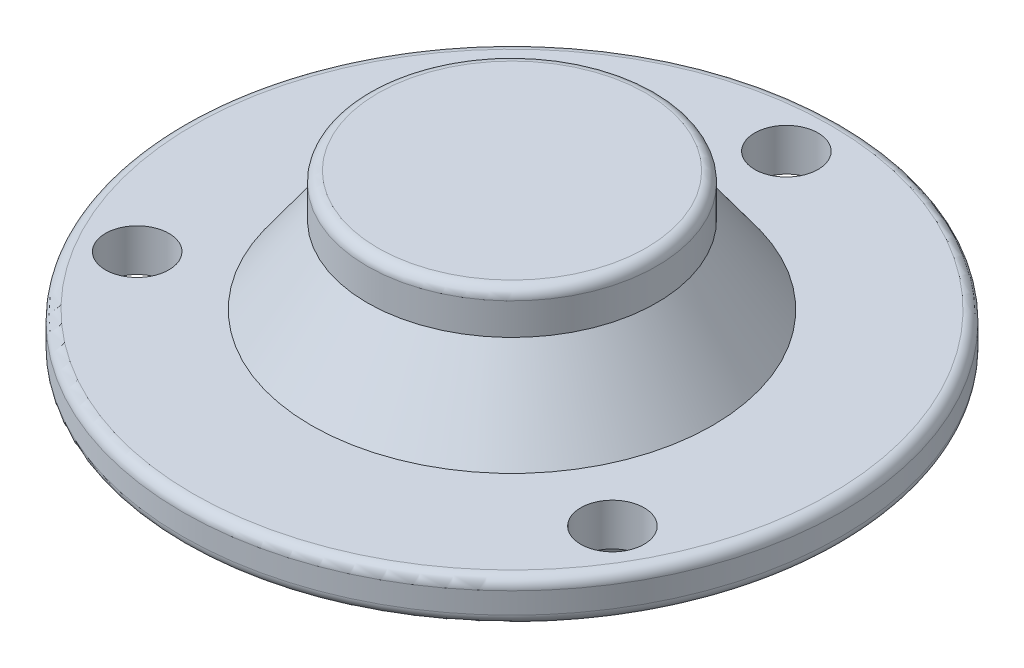
ISO-10303-21;
HEADER;
FILE_DESCRIPTION(('STEP AP214'),'2;1');
FILE_NAME('part.step','',(''),(''),'','','');
FILE_SCHEMA(('AUTOMOTIVE_DESIGN { 1 0 10303 214 1 1 1 1 }'));
ENDSEC;
DATA;
#1=APPLICATION_CONTEXT('core data for automotive mechanical design processes');
#2=APPLICATION_PROTOCOL_DEFINITION('international standard','automotive_design',2000,#1);
#3=PRODUCT_CONTEXT('',#1,'mechanical');
#4=PRODUCT('Part','Part','',(#3));
#5=PRODUCT_RELATED_PRODUCT_CATEGORY('part','',(#4));
#6=PRODUCT_DEFINITION_FORMATION('','',#4);
#7=PRODUCT_DEFINITION_CONTEXT('part definition',#1,'design');
#8=PRODUCT_DEFINITION('design','',#6,#7);
#9=PRODUCT_DEFINITION_SHAPE('','',#8);
#10=(LENGTH_UNIT() NAMED_UNIT(*) SI_UNIT(.MILLI.,.METRE.));
#11=(NAMED_UNIT(*) PLANE_ANGLE_UNIT() SI_UNIT($,.RADIAN.));
#12=(NAMED_UNIT(*) SI_UNIT($,.STERADIAN.) SOLID_ANGLE_UNIT());
#13=UNCERTAINTY_MEASURE_WITH_UNIT(LENGTH_MEASURE(1.E-05),#10,'distance_accuracy_value','');
#14=(GEOMETRIC_REPRESENTATION_CONTEXT(3) GLOBAL_UNCERTAINTY_ASSIGNED_CONTEXT((#13)) GLOBAL_UNIT_ASSIGNED_CONTEXT((#10,
#11,#12)) REPRESENTATION_CONTEXT('',''));
#15=CARTESIAN_POINT('',(0.,0.,0.));
#16=DIRECTION('',(0.,0.,1.));
#17=DIRECTION('',(1.,0.,0.));
#18=AXIS2_PLACEMENT_3D('',#15,#16,#17);
#19=CARTESIAN_POINT('',(0.,-5.05,0.));
#20=DIRECTION('',(0.,1.,0.));
#21=DIRECTION('',(-1.,0.,0.));
#22=AXIS2_PLACEMENT_3D('',#19,#20,#21);
#23=SPHERICAL_SURFACE('',#22,6.25);
#24=CARTESIAN_POINT('',(0.,-8.95445544554456,0.));
#25=DIRECTION('',(0.,1.,0.));
#26=DIRECTION('',(0.,0.,1.));
#27=AXIS2_PLACEMENT_3D('',#24,#25,#26);
#28=CIRCLE('',#27,4.88034093827034);
#29=CARTESIAN_POINT('',(4.88034093827034,-8.95445544554456,0.));
#30=VERTEX_POINT('',#29);
#31=EDGE_CURVE('E59',#30,#30,#28,.T.);
#32=ORIENTED_EDGE('',*,*,#31,.F.);
#33=EDGE_LOOP('',(#32));
#34=FACE_BOUND('',#33,.T.);
#35=ADVANCED_FACE('F33',(#34),#23,.T.);
#36=CARTESIAN_POINT('',(0.,0.,0.));
#37=DIRECTION('',(0.,1.,0.));
#38=DIRECTION('',(1.,0.,0.));
#39=AXIS2_PLACEMENT_3D('',#36,#37,#38);
#40=SPHERICAL_SURFACE('',#39,10.1980390271856);
#41=CARTESIAN_POINT('',(0.,-2.,0.));
#42=DIRECTION('',(0.,1.,0.));
#43=DIRECTION('',(0.,0.,1.));
#44=AXIS2_PLACEMENT_3D('',#41,#42,#43);
#45=CIRCLE('',#44,10.);
#46=CARTESIAN_POINT('',(10.,-2.,0.));
#47=VERTEX_POINT('',#46);
#48=EDGE_CURVE('E62',#47,#47,#45,.T.);
#49=CARTESIAN_POINT('',(10.,-2.,0.));
#50=CARTESIAN_POINT('',(9.98178386468159,-2.09108241098406,0.));
#51=CARTESIAN_POINT('',(9.96232267861538,-2.1819157953975,0.));
#52=CARTESIAN_POINT('',(9.9209261913754,-2.36301702852967,0.));
#53=CARTESIAN_POINT('',(9.89899089020162,-2.45328487724841,0.));
#54=CARTESIAN_POINT('',(9.85266215913455,-2.63318755643774,0.));
#55=CARTESIAN_POINT('',(9.82826872924124,-2.72282238690834,0.));
#56=CARTESIAN_POINT('',(9.77704205728847,-2.90139213278964,0.));
#57=CARTESIAN_POINT('',(9.750208815229,-2.99032704820035,0.));
#58=CARTESIAN_POINT('',(9.69412252442361,-3.16743055938728,0.));
#59=CARTESIAN_POINT('',(9.66486947567769,-3.2555991551635,0.));
#60=CARTESIAN_POINT('',(9.60396541912477,-3.43110420275834,0.));
#61=CARTESIAN_POINT('',(9.57231441131777,-3.51844065457694,0.));
#62=CARTESIAN_POINT('',(9.50663806504538,-3.69221620902962,0.));
#63=CARTESIAN_POINT('',(9.47261272657999,-3.77865531166369,0.));
#64=CARTESIAN_POINT('',(9.40221312260305,-3.950571633058,0.));
#65=CARTESIAN_POINT('',(9.36583885709148,-4.03604885181824,0.));
#66=CARTESIAN_POINT('',(9.29076855564282,-4.20597758875493,0.));
#67=CARTESIAN_POINT('',(9.25207251970572,-4.29042910693138,0.));
#68=CARTESIAN_POINT('',(9.17238756762689,-4.45824339181308,0.));
#69=CARTESIAN_POINT('',(9.13139865148516,-4.54160615851833,0.));
#70=CARTESIAN_POINT('',(9.04715854101678,-4.707180702413,0.));
#71=CARTESIAN_POINT('',(9.00390734669013,-4.78939247960243,0.));
#72=CARTESIAN_POINT('',(8.91517497088541,-4.95260366574435,0.));
#73=CARTESIAN_POINT('',(8.86969378940733,-5.03360307469685,0.));
#74=CARTESIAN_POINT('',(8.77653539522208,-5.19432905078841,0.));
#75=CARTESIAN_POINT('',(8.7288581825149,-5.27405561792747,0.));
#76=CARTESIAN_POINT('',(8.63134332133586,-5.43217638711042,0.));
#77=CARTESIAN_POINT('',(8.581505672864,-5.5105705891543,0.));
#78=CARTESIAN_POINT('',(8.47970714858555,-5.66596809959928,0.));
#79=CARTESIAN_POINT('',(8.42774627277895,-5.74297140800038,0.));
#80=CARTESIAN_POINT('',(8.32174008744734,-5.89552964104341,0.));
#81=CARTESIAN_POINT('',(8.26769477792231,-5.97108456568533,0.));
#82=CARTESIAN_POINT('',(8.15756007499332,-6.1206896224465,0.));
#83=CARTESIAN_POINT('',(8.10147068158936,-6.19473975456575,0.));
#84=CARTESIAN_POINT('',(7.98728968684034,-6.34127994098537,0.));
#85=CARTESIAN_POINT('',(7.92919808549528,-6.41376999528573,0.));
#86=CARTESIAN_POINT('',(7.81105604563593,-6.55713590551421,0.));
#87=CARTESIAN_POINT('',(7.75100560712165,-6.62801176144234,0.));
#88=CARTESIAN_POINT('',(7.62899072614951,-6.76809635952196,0.));
#89=CARTESIAN_POINT('',(7.56702628369166,-6.83730510167346,0.));
#90=CARTESIAN_POINT('',(7.44122965703951,-6.97400380145037,0.));
#91=CARTESIAN_POINT('',(7.3773974728452,-7.04149375907578,0.));
#92=CARTESIAN_POINT('',(7.24791301937029,-7.17470450228409,0.));
#93=CARTESIAN_POINT('',(7.18226075008968,-7.24042528786697,0.));
#94=CARTESIAN_POINT('',(7.04918514195292,-7.37004862032176,0.));
#95=CARTESIAN_POINT('',(6.98176180309678,-7.43395116719367,0.));
#96=CARTESIAN_POINT('',(6.84519439359431,-7.55989031305367,0.));
#97=CARTESIAN_POINT('',(6.77605032294799,-7.62192691204177,0.));
#98=CARTESIAN_POINT('',(6.63609307231123,-7.74408784602105,0.));
#99=CARTESIAN_POINT('',(6.56527989232078,-7.80421218101224,0.));
#100=CARTESIAN_POINT('',(6.42203729168125,-7.92250369872964,0.));
#101=CARTESIAN_POINT('',(6.34960787103216,-7.98067088145585,0.));
#102=CARTESIAN_POINT('',(6.20318686408218,-8.09500466696468,0.));
#103=CARTESIAN_POINT('',(6.12919527778129,-8.1511712697473,0.));
#104=CARTESIAN_POINT('',(5.97970518215096,-8.26146196357186,0.));
#105=CARTESIAN_POINT('',(5.90420667282153,-8.31558605461379,0.));
#106=CARTESIAN_POINT('',(5.75175909390849,-8.42175130963916,0.));
#107=CARTESIAN_POINT('',(5.6748100243249,-8.47379247362259,0.));
#108=CARTESIAN_POINT('',(5.51951878896807,-8.57575304582979,0.));
#109=CARTESIAN_POINT('',(5.44117662319484,-8.62567245405356,0.));
#110=CARTESIAN_POINT('',(5.28315763125653,-8.7233521525,0.));
#111=CARTESIAN_POINT('',(5.20348080509145,-8.77111244272266,0.));
#112=CARTESIAN_POINT('',(5.04285217967212,-8.86443859390066,0.));
#113=CARTESIAN_POINT('',(4.96190038041786,-8.910004454856,0.));
#114=CARTESIAN_POINT('',(4.88034093827034,-8.95445544554456,0.));
#115=B_SPLINE_CURVE_WITH_KNOTS('',3,(#49,#50,#51,#52,#53,#54,#55,#56,#57,#58,#59,#60,#61,#62,
#63,#64,#65,#66,#67,#68,#69,#70,#71,#72,#73,#74,#75,#76,#77,#78,#79,#80,#81,#82,#83,#84,#85,#86,
#87,#88,#89,#90,#91,#92,#93,#94,#95,#96,#97,#98,#99,#100,#101,#102,#103,#104,#105,#106,#107,
#108,#109,#110,#111,#112,#113,#114),.UNSPECIFIED.,.F.,.F.,(4,2,2,2,2,2,2,2,2,2,2,2,2,2,2,2,2,2,
2,2,2,2,2,2,2,2,2,2,2,2,2,2,4),(0.,0.278649694487393,0.557299388974787,0.83594908346218,
1.11459877794957,1.39324847243697,1.67189816692436,1.95054786141175,2.22919755589915,
2.50784725038654,2.78649694487394,3.06514663936133,3.34379633384872,3.62244602833612,
3.90109572282351,4.1797454173109,4.4583951117983,4.73704480628569,5.01569450077308,
5.29434419526048,5.57299388974787,5.85164358423526,6.13029327872266,6.40894297321005,
6.68759266769744,6.96624236218484,7.24489205667223,7.52354175115962,7.80219144564701,
8.08084114013441,8.3594908346218,8.63814052910919,8.91679022359659),.UNSPECIFIED.);
#116=EDGE_CURVE('BSEAM118',#47,#30,#115,.T.);
#117=ORIENTED_EDGE('',*,*,#48,.F.);
#118=ORIENTED_EDGE('',*,*,#31,.T.);
#119=ORIENTED_EDGE('',*,*,#116,.T.);
#120=ORIENTED_EDGE('',*,*,#116,.F.);
#121=EDGE_LOOP('',(#117,#119,#118,#120));
#122=FACE_BOUND('',#121,.T.);
#123=ADVANCED_FACE('F118',(#122),#40,.T.);
#124=CARTESIAN_POINT('',(15.6,-2.,0.));
#125=DIRECTION('',(0.,1.,0.));
#126=DIRECTION('',(0.,0.,1.));
#127=AXIS2_PLACEMENT_3D('',#124,#125,#126);
#128=PLANE('',#127);
#129=CARTESIAN_POINT('',(-11.25,-2.,6.49519052838329));
#130=DIRECTION('',(0.,1.,0.));
#131=DIRECTION('',(0.,0.,1.));
#132=AXIS2_PLACEMENT_3D('',#129,#130,#131);
#133=CIRCLE('',#132,1.5);
#134=CARTESIAN_POINT('',(-11.25,-2.,7.99519052838329));
#135=VERTEX_POINT('',#134);
#136=EDGE_CURVE('E83',#135,#135,#133,.T.);
#137=ORIENTED_EDGE('',*,*,#136,.T.);
#138=EDGE_LOOP('',(#137));
#139=FACE_BOUND('',#138,.T.);
#140=CARTESIAN_POINT('',(11.25,-2.,6.49519052838329));
#141=DIRECTION('',(0.,1.,0.));
#142=DIRECTION('',(0.,0.,1.));
#143=AXIS2_PLACEMENT_3D('',#140,#141,#142);
#144=CIRCLE('',#143,1.5);
#145=CARTESIAN_POINT('',(11.25,-2.,7.99519052838329));
#146=VERTEX_POINT('',#145);
#147=EDGE_CURVE('E77',#146,#146,#144,.T.);
#148=ORIENTED_EDGE('',*,*,#147,.T.);
#149=EDGE_LOOP('',(#148));
#150=FACE_BOUND('',#149,.T.);
#151=CARTESIAN_POINT('',(0.,-2.,-12.9903810567666));
#152=DIRECTION('',(0.,1.,0.));
#153=DIRECTION('',(0.,0.,1.));
#154=AXIS2_PLACEMENT_3D('',#151,#152,#153);
#155=CIRCLE('',#154,1.5);
#156=CARTESIAN_POINT('',(0.,-2.,-11.4903810567666));
#157=VERTEX_POINT('',#156);
#158=EDGE_CURVE('E71',#157,#157,#155,.T.);
#159=ORIENTED_EDGE('',*,*,#158,.T.);
#160=EDGE_LOOP('',(#159));
#161=FACE_BOUND('',#160,.T.);
#162=CARTESIAN_POINT('',(0.,-2.,0.));
#163=DIRECTION('',(0.,1.,0.));
#164=DIRECTION('',(0.,0.,1.));
#165=AXIS2_PLACEMENT_3D('',#162,#163,#164);
#166=CIRCLE('',#165,15.1);
#167=CARTESIAN_POINT('',(0.,-2.,15.1));
#168=VERTEX_POINT('',#167);
#169=EDGE_CURVE('E48',#168,#168,#166,.F.);
#170=ORIENTED_EDGE('',*,*,#169,.T.);
#171=EDGE_LOOP('',(#170));
#172=FACE_BOUND('',#171,.T.);
#173=ORIENTED_EDGE('',*,*,#48,.T.);
#174=EDGE_LOOP('',(#173));
#175=FACE_BOUND('',#174,.T.);
#176=ADVANCED_FACE('F124',(#139,#150,#161,#172,#175),#128,.F.);
#177=CARTESIAN_POINT('',(0.,5.7,0.));
#178=DIRECTION('',(0.,1.,0.));
#179=DIRECTION('',(0.,0.,1.));
#180=AXIS2_PLACEMENT_3D('',#177,#178,#179);
#181=CYLINDRICAL_SURFACE('',#180,15.6);
#182=CARTESIAN_POINT('',(0.,-1.5,0.));
#183=DIRECTION('',(0.,1.,0.));
#184=DIRECTION('',(0.,0.,1.));
#185=AXIS2_PLACEMENT_3D('',#182,#183,#184);
#186=CIRCLE('',#185,15.6);
#187=CARTESIAN_POINT('',(0.,-1.5,15.6));
#188=VERTEX_POINT('',#187);
#189=EDGE_CURVE('E53',#188,#188,#186,.T.);
#190=ORIENTED_EDGE('',*,*,#189,.T.);
#191=EDGE_LOOP('',(#190));
#192=FACE_BOUND('',#191,.T.);
#193=CARTESIAN_POINT('',(0.,-0.5,0.));
#194=DIRECTION('',(0.,-1.,0.));
#195=DIRECTION('',(0.,0.,-1.));
#196=AXIS2_PLACEMENT_3D('',#193,#194,#195);
#197=CIRCLE('',#196,15.6);
#198=CARTESIAN_POINT('',(0.,-0.5,-15.6));
#199=VERTEX_POINT('',#198);
#200=EDGE_CURVE('E56',#199,#199,#197,.T.);
#201=ORIENTED_EDGE('',*,*,#200,.T.);
#202=EDGE_LOOP('',(#201));
#203=FACE_BOUND('',#202,.T.);
#204=ADVANCED_FACE('F97',(#192,#203),#181,.T.);
#205=CARTESIAN_POINT('',(9.5,0.,0.));
#206=DIRECTION('',(0.,-1.,0.));
#207=DIRECTION('',(0.,0.,-1.));
#208=AXIS2_PLACEMENT_3D('',#205,#206,#207);
#209=PLANE('',#208);
#210=CARTESIAN_POINT('',(-11.25,0.,6.49519052838329));
#211=DIRECTION('',(0.,1.,0.));
#212=DIRECTION('',(0.,0.,1.));
#213=AXIS2_PLACEMENT_3D('',#210,#211,#212);
#214=CIRCLE('',#213,1.5);
#215=CARTESIAN_POINT('',(-11.25,0.,7.99519052838329));
#216=VERTEX_POINT('',#215);
#217=EDGE_CURVE('E86',#216,#216,#214,.T.);
#218=ORIENTED_EDGE('',*,*,#217,.F.);
#219=EDGE_LOOP('',(#218));
#220=FACE_BOUND('',#219,.T.);
#221=CARTESIAN_POINT('',(11.25,0.,6.49519052838329));
#222=DIRECTION('',(0.,1.,0.));
#223=DIRECTION('',(0.,0.,1.));
#224=AXIS2_PLACEMENT_3D('',#221,#222,#223);
#225=CIRCLE('',#224,1.5);
#226=CARTESIAN_POINT('',(11.25,0.,7.99519052838329));
#227=VERTEX_POINT('',#226);
#228=EDGE_CURVE('E80',#227,#227,#225,.T.);
#229=ORIENTED_EDGE('',*,*,#228,.F.);
#230=EDGE_LOOP('',(#229));
#231=FACE_BOUND('',#230,.T.);
#232=CARTESIAN_POINT('',(0.,0.,-12.9903810567666));
#233=DIRECTION('',(0.,1.,0.));
#234=DIRECTION('',(0.,0.,1.));
#235=AXIS2_PLACEMENT_3D('',#232,#233,#234);
#236=CIRCLE('',#235,1.5);
#237=CARTESIAN_POINT('',(0.,0.,-11.4903810567666));
#238=VERTEX_POINT('',#237);
#239=EDGE_CURVE('E74',#238,#238,#236,.T.);
#240=ORIENTED_EDGE('',*,*,#239,.F.);
#241=EDGE_LOOP('',(#240));
#242=FACE_BOUND('',#241,.T.);
#243=CARTESIAN_POINT('',(0.,0.,0.));
#244=DIRECTION('',(0.,-1.,0.));
#245=DIRECTION('',(0.,0.,-1.));
#246=AXIS2_PLACEMENT_3D('',#243,#244,#245);
#247=CIRCLE('',#246,15.1);
#248=CARTESIAN_POINT('',(0.,0.,-15.1));
#249=VERTEX_POINT('',#248);
#250=EDGE_CURVE('E44',#249,#249,#247,.F.);
#251=ORIENTED_EDGE('',*,*,#250,.T.);
#252=EDGE_LOOP('',(#251));
#253=FACE_BOUND('',#252,.T.);
#254=CARTESIAN_POINT('',(0.,0.,0.));
#255=DIRECTION('',(0.,1.,0.));
#256=DIRECTION('',(0.,0.,1.));
#257=AXIS2_PLACEMENT_3D('',#254,#255,#256);
#258=CIRCLE('',#257,9.5);
#259=CARTESIAN_POINT('',(0.,0.,9.5));
#260=VERTEX_POINT('',#259);
#261=EDGE_CURVE('E65',#260,#260,#258,.T.);
#262=ORIENTED_EDGE('',*,*,#261,.F.);
#263=EDGE_LOOP('',(#262));
#264=FACE_BOUND('',#263,.T.);
#265=ADVANCED_FACE('F93',(#220,#231,#242,#253,#264),#209,.F.);
#266=CARTESIAN_POINT('',(0.,0.,0.));
#267=DIRECTION('',(0.,-1.,0.));
#268=DIRECTION('',(0.,0.,-1.));
#269=AXIS2_PLACEMENT_3D('',#266,#267,#268);
#270=CONICAL_SURFACE('',#269,9.5,0.621526624496622);
#271=CARTESIAN_POINT('',(0.,3.7,0.));
#272=DIRECTION('',(0.,1.,0.));
#273=DIRECTION('',(0.,0.,1.));
#274=AXIS2_PLACEMENT_3D('',#271,#272,#273);
#275=CIRCLE('',#274,6.85);
#276=CARTESIAN_POINT('',(0.,3.7,6.85));
#277=VERTEX_POINT('',#276);
#278=EDGE_CURVE('E68',#277,#277,#275,.T.);
#279=ORIENTED_EDGE('',*,*,#278,.F.);
#280=EDGE_LOOP('',(#279));
#281=FACE_BOUND('',#280,.T.);
#282=ORIENTED_EDGE('',*,*,#261,.T.);
#283=EDGE_LOOP('',(#282));
#284=FACE_BOUND('',#283,.T.);
#285=ADVANCED_FACE('F96',(#281,#284),#270,.T.);
#286=CARTESIAN_POINT('',(0.,5.7,0.));
#287=DIRECTION('',(0.,1.,0.));
#288=DIRECTION('',(0.,0.,1.));
#289=AXIS2_PLACEMENT_3D('',#286,#287,#288);
#290=CYLINDRICAL_SURFACE('',#289,6.85);
#291=CARTESIAN_POINT('',(0.,5.2,0.));
#292=DIRECTION('',(0.,-1.,0.));
#293=DIRECTION('',(0.,0.,-1.));
#294=AXIS2_PLACEMENT_3D('',#291,#292,#293);
#295=CIRCLE('',#294,6.85);
#296=CARTESIAN_POINT('',(0.,5.2,-6.85));
#297=VERTEX_POINT('',#296);
#298=EDGE_CURVE('E10',#297,#297,#295,.T.);
#299=ORIENTED_EDGE('',*,*,#298,.T.);
#300=EDGE_LOOP('',(#299));
#301=FACE_BOUND('',#300,.T.);
#302=ORIENTED_EDGE('',*,*,#278,.T.);
#303=EDGE_LOOP('',(#302));
#304=FACE_BOUND('',#303,.T.);
#305=ADVANCED_FACE('F108',(#301,#304),#290,.T.);
#306=CARTESIAN_POINT('',(0.,5.7,0.));
#307=DIRECTION('',(0.,-1.,0.));
#308=DIRECTION('',(0.,0.,-1.));
#309=AXIS2_PLACEMENT_3D('',#306,#307,#308);
#310=PLANE('',#309);
#311=CARTESIAN_POINT('',(0.,5.7,0.));
#312=DIRECTION('',(0.,-1.,0.));
#313=DIRECTION('',(0.,0.,-1.));
#314=AXIS2_PLACEMENT_3D('',#311,#312,#313);
#315=CIRCLE('',#314,6.35);
#316=CARTESIAN_POINT('',(0.,5.7,-6.35));
#317=VERTEX_POINT('',#316);
#318=EDGE_CURVE('E40',#317,#317,#315,.F.);
#319=ORIENTED_EDGE('',*,*,#318,.T.);
#320=EDGE_LOOP('',(#319));
#321=FACE_BOUND('',#320,.T.);
#322=ADVANCED_FACE('F114',(#321),#310,.F.);
#323=CARTESIAN_POINT('',(0.,-1.5,0.));
#324=DIRECTION('',(0.,1.,0.));
#325=DIRECTION('',(0.,0.,1.));
#326=AXIS2_PLACEMENT_3D('',#323,#324,#325);
#327=TOROIDAL_SURFACE('',#326,15.1,0.5);
#328=ORIENTED_EDGE('',*,*,#169,.F.);
#329=EDGE_LOOP('',(#328));
#330=FACE_BOUND('',#329,.T.);
#331=ORIENTED_EDGE('',*,*,#189,.F.);
#332=EDGE_LOOP('',(#331));
#333=FACE_BOUND('',#332,.T.);
#334=ADVANCED_FACE('F130',(#330,#333),#327,.T.);
#335=CARTESIAN_POINT('',(0.,-0.5,0.));
#336=DIRECTION('',(0.,-1.,0.));
#337=DIRECTION('',(0.,0.,-1.));
#338=AXIS2_PLACEMENT_3D('',#335,#336,#337);
#339=TOROIDAL_SURFACE('',#338,15.1,0.5);
#340=ORIENTED_EDGE('',*,*,#200,.F.);
#341=EDGE_LOOP('',(#340));
#342=FACE_BOUND('',#341,.T.);
#343=ORIENTED_EDGE('',*,*,#250,.F.);
#344=EDGE_LOOP('',(#343));
#345=FACE_BOUND('',#344,.T.);
#346=ADVANCED_FACE('F132',(#342,#345),#339,.T.);
#347=CARTESIAN_POINT('',(0.,5.2,0.));
#348=DIRECTION('',(0.,-1.,0.));
#349=DIRECTION('',(0.,0.,-1.));
#350=AXIS2_PLACEMENT_3D('',#347,#348,#349);
#351=TOROIDAL_SURFACE('',#350,6.35,0.5);
#352=ORIENTED_EDGE('',*,*,#298,.F.);
#353=EDGE_LOOP('',(#352));
#354=FACE_BOUND('',#353,.T.);
#355=ORIENTED_EDGE('',*,*,#318,.F.);
#356=EDGE_LOOP('',(#355));
#357=FACE_BOUND('',#356,.T.);
#358=ADVANCED_FACE('F35',(#354,#357),#351,.T.);
#359=CARTESIAN_POINT('',(0.,-10.,-12.9903810567666));
#360=DIRECTION('',(0.,1.,0.));
#361=DIRECTION('',(0.,0.,1.));
#362=AXIS2_PLACEMENT_3D('',#359,#360,#361);
#363=CYLINDRICAL_SURFACE('',#362,1.5);
#364=ORIENTED_EDGE('',*,*,#239,.T.);
#365=EDGE_LOOP('',(#364));
#366=FACE_BOUND('',#365,.T.);
#367=ORIENTED_EDGE('',*,*,#158,.F.);
#368=EDGE_LOOP('',(#367));
#369=FACE_BOUND('',#368,.T.);
#370=ADVANCED_FACE('F139',(#366,#369),#363,.F.);
#371=CARTESIAN_POINT('',(11.25,-10.,6.49519052838329));
#372=DIRECTION('',(0.,1.,0.));
#373=DIRECTION('',(0.,0.,1.));
#374=AXIS2_PLACEMENT_3D('',#371,#372,#373);
#375=CYLINDRICAL_SURFACE('',#374,1.5);
#376=ORIENTED_EDGE('',*,*,#228,.T.);
#377=EDGE_LOOP('',(#376));
#378=FACE_BOUND('',#377,.T.);
#379=ORIENTED_EDGE('',*,*,#147,.F.);
#380=EDGE_LOOP('',(#379));
#381=FACE_BOUND('',#380,.T.);
#382=ADVANCED_FACE('F167',(#378,#381),#375,.F.);
#383=CARTESIAN_POINT('',(-11.25,-10.,6.49519052838329));
#384=DIRECTION('',(0.,1.,0.));
#385=DIRECTION('',(0.,0.,1.));
#386=AXIS2_PLACEMENT_3D('',#383,#384,#385);
#387=CYLINDRICAL_SURFACE('',#386,1.5);
#388=ORIENTED_EDGE('',*,*,#217,.T.);
#389=EDGE_LOOP('',(#388));
#390=FACE_BOUND('',#389,.T.);
#391=ORIENTED_EDGE('',*,*,#136,.F.);
#392=EDGE_LOOP('',(#391));
#393=FACE_BOUND('',#392,.T.);
#394=ADVANCED_FACE('F90',(#390,#393),#387,.F.);
#395=CLOSED_SHELL('',(#35,#123,#176,#204,#265,#285,#305,#322,#334,#346,#358,#370,#382,#394));
#396=MANIFOLD_SOLID_BREP('B2',#395);
#397=ADVANCED_BREP_SHAPE_REPRESENTATION('',(#18,#396),#14);
#398=SHAPE_DEFINITION_REPRESENTATION(#9,#397);
ENDSEC;
END-ISO-10303-21;
